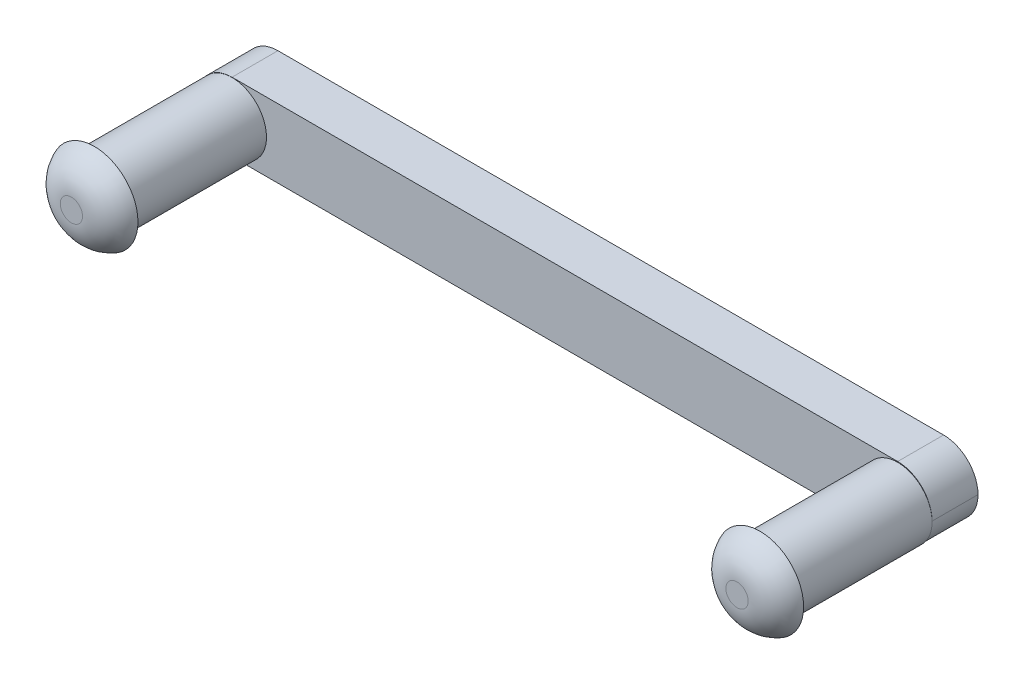
ISO-10303-21;
HEADER;
FILE_DESCRIPTION(('STEP AP214'),'2;1');
FILE_NAME('part.step','',(''),(''),'','','');
FILE_SCHEMA(('AUTOMOTIVE_DESIGN { 1 0 10303 214 1 1 1 1 }'));
ENDSEC;
DATA;
#1=APPLICATION_CONTEXT('core data for automotive mechanical design processes');
#2=APPLICATION_PROTOCOL_DEFINITION('international standard','automotive_design',2000,#1);
#3=PRODUCT_CONTEXT('',#1,'mechanical');
#4=PRODUCT('Part','Part','',(#3));
#5=PRODUCT_RELATED_PRODUCT_CATEGORY('part','',(#4));
#6=PRODUCT_DEFINITION_FORMATION('','',#4);
#7=PRODUCT_DEFINITION_CONTEXT('part definition',#1,'design');
#8=PRODUCT_DEFINITION('design','',#6,#7);
#9=PRODUCT_DEFINITION_SHAPE('','',#8);
#10=(LENGTH_UNIT() NAMED_UNIT(*) SI_UNIT(.MILLI.,.METRE.));
#11=(NAMED_UNIT(*) PLANE_ANGLE_UNIT() SI_UNIT($,.RADIAN.));
#12=(NAMED_UNIT(*) SI_UNIT($,.STERADIAN.) SOLID_ANGLE_UNIT());
#13=UNCERTAINTY_MEASURE_WITH_UNIT(LENGTH_MEASURE(1.E-05),#10,'distance_accuracy_value','');
#14=(GEOMETRIC_REPRESENTATION_CONTEXT(3) GLOBAL_UNCERTAINTY_ASSIGNED_CONTEXT((#13)) GLOBAL_UNIT_ASSIGNED_CONTEXT((#10,
#11,#12)) REPRESENTATION_CONTEXT('',''));
#15=CARTESIAN_POINT('',(0.,0.,0.));
#16=DIRECTION('',(0.,0.,1.));
#17=DIRECTION('',(1.,0.,0.));
#18=AXIS2_PLACEMENT_3D('',#15,#16,#17);
#19=CARTESIAN_POINT('',(17.5103207051958,11.8314666386004,2.));
#20=DIRECTION('',(0.,1.,0.));
#21=DIRECTION('',(0.,0.,1.));
#22=AXIS2_PLACEMENT_3D('',#19,#20,#21);
#23=PLANE('',#22);
#24=DIRECTION('',(1.,0.,0.));
#25=VECTOR('',#24,1.);
#26=CARTESIAN_POINT('',(17.5103207051958,11.8314666386004,2.));
#27=LINE('',#26,#25);
#28=CARTESIAN_POINT('',(19.0103207051958,11.8314666386004,2.));
#29=VERTEX_POINT('',#28);
#30=CARTESIAN_POINT('',(19.1841737499796,11.8314666386004,2.));
#31=VERTEX_POINT('',#30);
#32=EDGE_CURVE('E136',#29,#31,#27,.T.);
#33=ORIENTED_EDGE('',*,*,#32,.F.);
#34=DIRECTION('',(0.,0.,-1.));
#35=VECTOR('',#34,1.);
#36=CARTESIAN_POINT('',(19.0103207051958,11.8314666386004,2.));
#37=LINE('',#36,#35);
#38=CARTESIAN_POINT('',(19.0103207051958,11.8314666386004,0.));
#39=VERTEX_POINT('',#38);
#40=EDGE_CURVE('E205',#29,#39,#37,.T.);
#41=ORIENTED_EDGE('',*,*,#40,.T.);
#42=DIRECTION('',(1.,0.,0.));
#43=VECTOR('',#42,1.);
#44=CARTESIAN_POINT('',(17.5103207051958,11.8314666386004,0.));
#45=LINE('',#44,#43);
#46=CARTESIAN_POINT('',(48.0103207051958,11.8314666386004,0.));
#47=VERTEX_POINT('',#46);
#48=EDGE_CURVE('E145',#39,#47,#45,.T.);
#49=ORIENTED_EDGE('',*,*,#48,.T.);
#50=DIRECTION('',(0.,0.,-1.));
#51=VECTOR('',#50,1.);
#52=CARTESIAN_POINT('',(48.0103207051958,11.8314666386004,2.));
#53=LINE('',#52,#51);
#54=CARTESIAN_POINT('',(48.0103207051958,11.8314666386004,2.));
#55=VERTEX_POINT('',#54);
#56=EDGE_CURVE('E133',#47,#55,#53,.F.);
#57=ORIENTED_EDGE('',*,*,#56,.T.);
#58=CARTESIAN_POINT('',(47.7174160394953,11.8314666386004,2.));
#59=VERTEX_POINT('',#58);
#60=EDGE_CURVE('E109',#59,#55,#27,.T.);
#61=ORIENTED_EDGE('',*,*,#60,.F.);
#62=EDGE_CURVE('E131',#31,#59,#27,.T.);
#63=ORIENTED_EDGE('',*,*,#62,.F.);
#64=EDGE_LOOP('',(#33,#41,#49,#57,#61,#63));
#65=FACE_BOUND('',#64,.T.);
#66=ADVANCED_FACE('F33',(#65),#23,.F.);
#67=CARTESIAN_POINT('',(17.5103207051958,14.8314666386004,2.));
#68=DIRECTION('',(0.,-1.,0.));
#69=DIRECTION('',(0.,0.,-1.));
#70=AXIS2_PLACEMENT_3D('',#67,#68,#69);
#71=PLANE('',#70);
#72=DIRECTION('',(-1.,0.,0.));
#73=VECTOR('',#72,1.);
#74=CARTESIAN_POINT('',(17.5103207051958,14.8314666386004,0.));
#75=LINE('',#74,#73);
#76=CARTESIAN_POINT('',(48.0103207051958,14.8314666386004,0.));
#77=VERTEX_POINT('',#76);
#78=CARTESIAN_POINT('',(19.0103207051958,14.8314666386004,0.));
#79=VERTEX_POINT('',#78);
#80=EDGE_CURVE('E134',#77,#79,#75,.T.);
#81=ORIENTED_EDGE('',*,*,#80,.T.);
#82=DIRECTION('',(0.,0.,-1.));
#83=VECTOR('',#82,1.);
#84=CARTESIAN_POINT('',(19.0103207051958,14.8314666386004,2.));
#85=LINE('',#84,#83);
#86=CARTESIAN_POINT('',(19.0103207051958,14.8314666386004,2.));
#87=VERTEX_POINT('',#86);
#88=EDGE_CURVE('E270',#79,#87,#85,.F.);
#89=ORIENTED_EDGE('',*,*,#88,.T.);
#90=DIRECTION('',(-1.,0.,0.));
#91=VECTOR('',#90,1.);
#92=CARTESIAN_POINT('',(17.5103207051958,14.8314666386004,2.));
#93=LINE('',#92,#91);
#94=CARTESIAN_POINT('',(48.0103207051958,14.8314666386004,2.));
#95=VERTEX_POINT('',#94);
#96=EDGE_CURVE('E143',#95,#87,#93,.T.);
#97=ORIENTED_EDGE('',*,*,#96,.F.);
#98=DIRECTION('',(0.,0.,-1.));
#99=VECTOR('',#98,1.);
#100=CARTESIAN_POINT('',(48.0103207051958,14.8314666386004,2.));
#101=LINE('',#100,#99);
#102=EDGE_CURVE('E115',#95,#77,#101,.T.);
#103=ORIENTED_EDGE('',*,*,#102,.T.);
#104=EDGE_LOOP('',(#81,#89,#97,#103));
#105=FACE_BOUND('',#104,.T.);
#106=ADVANCED_FACE('F293',(#105),#71,.F.);
#107=CARTESIAN_POINT('',(0.,0.,2.));
#108=DIRECTION('',(0.,0.,1.));
#109=DIRECTION('',(1.,0.,0.));
#110=AXIS2_PLACEMENT_3D('',#107,#108,#109);
#111=PLANE('',#110);
#112=CARTESIAN_POINT('',(19.0103207051958,13.3314666386004,2.));
#113=DIRECTION('',(0.,0.,1.));
#114=DIRECTION('',(1.,0.,0.));
#115=AXIS2_PLACEMENT_3D('',#112,#113,#114);
#116=CIRCLE('',#115,1.5);
#117=CARTESIAN_POINT('',(17.5103207051958,13.3314666386004,2.));
#118=VERTEX_POINT('',#117);
#119=EDGE_CURVE('E55',#87,#118,#116,.T.);
#120=ORIENTED_EDGE('',*,*,#119,.T.);
#121=CARTESIAN_POINT('',(19.0103207051958,13.3314666386004,2.));
#122=DIRECTION('',(0.,0.,1.));
#123=DIRECTION('',(1.,0.,0.));
#124=AXIS2_PLACEMENT_3D('',#121,#122,#123);
#125=CIRCLE('',#124,1.5);
#126=CARTESIAN_POINT('',(17.519107837837,13.1693426606594,2.));
#127=VERTEX_POINT('',#126);
#128=EDGE_CURVE('E268',#118,#127,#125,.T.);
#129=ORIENTED_EDGE('',*,*,#128,.T.);
#130=CARTESIAN_POINT('',(19.0113726381342,13.321479986106,2.));
#131=DIRECTION('',(0.,0.,1.));
#132=DIRECTION('',(1.,0.,0.));
#133=AXIS2_PLACEMENT_3D('',#130,#131,#132);
#134=CIRCLE('',#133,1.5);
#135=EDGE_CURVE('E116',#31,#127,#134,.T.);
#136=ORIENTED_EDGE('',*,*,#135,.F.);
#137=ORIENTED_EDGE('',*,*,#62,.T.);
#138=CARTESIAN_POINT('',(48.0113726381342,13.3023811562106,2.));
#139=DIRECTION('',(0.,0.,1.));
#140=DIRECTION('',(1.,0.,0.));
#141=AXIS2_PLACEMENT_3D('',#138,#139,#140);
#142=CIRCLE('',#141,1.5);
#143=CARTESIAN_POINT('',(49.5097960524496,13.3711363118808,2.));
#144=VERTEX_POINT('',#143);
#145=EDGE_CURVE('E119',#144,#59,#142,.T.);
#146=ORIENTED_EDGE('',*,*,#145,.F.);
#147=CARTESIAN_POINT('',(48.0103207051958,13.3314666386004,2.));
#148=DIRECTION('',(0.,0.,1.));
#149=DIRECTION('',(1.,0.,0.));
#150=AXIS2_PLACEMENT_3D('',#147,#148,#149);
#151=CIRCLE('',#150,1.5);
#152=EDGE_CURVE('E193',#144,#95,#151,.T.);
#153=ORIENTED_EDGE('',*,*,#152,.T.);
#154=ORIENTED_EDGE('',*,*,#96,.T.);
#155=EDGE_LOOP('',(#120,#129,#136,#137,#146,#153,#154));
#156=FACE_BOUND('',#155,.T.);
#157=ADVANCED_FACE('F138',(#156),#111,.T.);
#158=CARTESIAN_POINT('',(0.,0.,0.));
#159=DIRECTION('',(0.,0.,1.));
#160=DIRECTION('',(1.,0.,0.));
#161=AXIS2_PLACEMENT_3D('',#158,#159,#160);
#162=PLANE('',#161);
#163=ORIENTED_EDGE('',*,*,#48,.F.);
#164=CARTESIAN_POINT('',(19.0103207051958,13.3314666386004,0.));
#165=DIRECTION('',(0.,0.,1.));
#166=DIRECTION('',(1.,0.,0.));
#167=AXIS2_PLACEMENT_3D('',#164,#165,#166);
#168=CIRCLE('',#167,1.5);
#169=CARTESIAN_POINT('',(17.5103207051958,13.3314666386004,0.));
#170=VERTEX_POINT('',#169);
#171=EDGE_CURVE('E265',#39,#170,#168,.F.);
#172=ORIENTED_EDGE('',*,*,#171,.T.);
#173=CARTESIAN_POINT('',(19.0103207051958,13.3314666386004,0.));
#174=DIRECTION('',(0.,0.,1.));
#175=DIRECTION('',(1.,0.,0.));
#176=AXIS2_PLACEMENT_3D('',#173,#174,#175);
#177=CIRCLE('',#176,1.5);
#178=EDGE_CURVE('E263',#170,#79,#177,.F.);
#179=ORIENTED_EDGE('',*,*,#178,.T.);
#180=ORIENTED_EDGE('',*,*,#80,.F.);
#181=CARTESIAN_POINT('',(48.0103207051958,13.3314666386004,0.));
#182=DIRECTION('',(0.,0.,1.));
#183=DIRECTION('',(1.,0.,0.));
#184=AXIS2_PLACEMENT_3D('',#181,#182,#183);
#185=CIRCLE('',#184,1.5);
#186=CARTESIAN_POINT('',(49.5103207051958,13.3314666386004,0.));
#187=VERTEX_POINT('',#186);
#188=EDGE_CURVE('E157',#77,#187,#185,.F.);
#189=ORIENTED_EDGE('',*,*,#188,.T.);
#190=CARTESIAN_POINT('',(48.0103207051958,13.3314666386004,0.));
#191=DIRECTION('',(0.,0.,1.));
#192=DIRECTION('',(1.,0.,0.));
#193=AXIS2_PLACEMENT_3D('',#190,#191,#192);
#194=CIRCLE('',#193,1.5);
#195=EDGE_CURVE('E154',#187,#47,#194,.F.);
#196=ORIENTED_EDGE('',*,*,#195,.T.);
#197=EDGE_LOOP('',(#163,#172,#179,#180,#189,#196));
#198=FACE_BOUND('',#197,.T.);
#199=ADVANCED_FACE('F301',(#198),#162,.F.);
#200=CARTESIAN_POINT('',(19.0113726381342,13.321479986106,2.));
#201=DIRECTION('',(0.,0.,1.));
#202=DIRECTION('',(1.,0.,0.));
#203=AXIS2_PLACEMENT_3D('',#200,#201,#202);
#204=PLANE('',#203);
#205=EDGE_CURVE('E48',#127,#31,#134,.T.);
#206=ORIENTED_EDGE('',*,*,#205,.F.);
#207=CARTESIAN_POINT('',(19.0103207051958,13.3314666386004,2.));
#208=DIRECTION('',(0.,0.,1.));
#209=DIRECTION('',(1.,0.,0.));
#210=AXIS2_PLACEMENT_3D('',#207,#208,#209);
#211=CIRCLE('',#210,1.5);
#212=EDGE_CURVE('E272',#127,#29,#211,.T.);
#213=ORIENTED_EDGE('',*,*,#212,.T.);
#214=ORIENTED_EDGE('',*,*,#32,.T.);
#215=EDGE_LOOP('',(#206,#213,#214));
#216=FACE_BOUND('',#215,.T.);
#217=ADVANCED_FACE('F185',(#216),#204,.F.);
#218=CARTESIAN_POINT('',(19.0113726381342,13.321479986106,8.));
#219=DIRECTION('',(0.,0.,-1.));
#220=DIRECTION('',(-1.,0.,0.));
#221=AXIS2_PLACEMENT_3D('',#218,#219,#220);
#222=CYLINDRICAL_SURFACE('',#221,1.5);
#223=CARTESIAN_POINT('',(19.0113726381342,13.321479986106,8.));
#224=DIRECTION('',(0.,0.,1.));
#225=DIRECTION('',(1.,0.,0.));
#226=AXIS2_PLACEMENT_3D('',#223,#224,#225);
#227=CIRCLE('',#226,1.5);
#228=CARTESIAN_POINT('',(20.5113726381342,13.321479986106,8.));
#229=VERTEX_POINT('',#228);
#230=EDGE_CURVE('E147',#229,#229,#227,.T.);
#231=ORIENTED_EDGE('',*,*,#230,.F.);
#232=EDGE_LOOP('',(#231));
#233=FACE_BOUND('',#232,.T.);
#234=ORIENTED_EDGE('',*,*,#205,.T.);
#235=ORIENTED_EDGE('',*,*,#135,.T.);
#236=EDGE_LOOP('',(#234,#235));
#237=FACE_BOUND('',#236,.T.);
#238=ADVANCED_FACE('F306',(#233,#237),#222,.T.);
#239=CARTESIAN_POINT('',(48.0113726381342,13.3023811562106,2.));
#240=DIRECTION('',(0.,0.,1.));
#241=DIRECTION('',(1.,0.,0.));
#242=AXIS2_PLACEMENT_3D('',#239,#240,#241);
#243=PLANE('',#242);
#244=CARTESIAN_POINT('',(48.0113726381342,13.3023811562106,2.));
#245=DIRECTION('',(0.,0.,1.));
#246=DIRECTION('',(1.,0.,0.));
#247=AXIS2_PLACEMENT_3D('',#244,#245,#246);
#248=CIRCLE('',#247,1.5);
#249=CARTESIAN_POINT('',(49.5103207051958,13.2462145090608,2.));
#250=VERTEX_POINT('',#249);
#251=EDGE_CURVE('E105',#250,#59,#248,.F.);
#252=ORIENTED_EDGE('',*,*,#251,.T.);
#253=ORIENTED_EDGE('',*,*,#60,.T.);
#254=CARTESIAN_POINT('',(48.0103207051958,13.3314666386004,2.));
#255=DIRECTION('',(0.,0.,1.));
#256=DIRECTION('',(1.,0.,0.));
#257=AXIS2_PLACEMENT_3D('',#254,#255,#256);
#258=CIRCLE('',#257,1.5);
#259=CARTESIAN_POINT('',(49.5107055193452,13.3314815724135,2.));
#260=VERTEX_POINT('',#259);
#261=EDGE_CURVE('E203',#55,#260,#258,.T.);
#262=ORIENTED_EDGE('',*,*,#261,.T.);
#263=CARTESIAN_POINT('',(48.0113726381342,13.3023811562106,2.));
#264=DIRECTION('',(0.,0.,1.));
#265=DIRECTION('',(0.999298711374452,-0.0374444314332525,0.));
#266=AXIS2_PLACEMENT_3D('',#263,#264,#265);
#267=CIRCLE('',#266,1.5);
#268=EDGE_CURVE('E112',#250,#260,#267,.T.);
#269=ORIENTED_EDGE('',*,*,#268,.F.);
#270=EDGE_LOOP('',(#252,#253,#262,#269));
#271=FACE_BOUND('',#270,.T.);
#272=ADVANCED_FACE('F107',(#271),#243,.F.);
#273=CARTESIAN_POINT('',(48.0113726381342,13.3023811562106,8.));
#274=DIRECTION('',(0.,0.,-1.));
#275=DIRECTION('',(-1.,0.,0.));
#276=AXIS2_PLACEMENT_3D('',#273,#274,#275);
#277=CYLINDRICAL_SURFACE('',#276,1.5);
#278=CARTESIAN_POINT('',(48.0113726381342,13.3023811562106,8.));
#279=DIRECTION('',(0.,0.,1.));
#280=DIRECTION('',(1.,0.,0.));
#281=AXIS2_PLACEMENT_3D('',#278,#279,#280);
#282=CIRCLE('',#281,1.5);
#283=CARTESIAN_POINT('',(49.5113726381342,13.3023811562106,8.));
#284=VERTEX_POINT('',#283);
#285=EDGE_CURVE('E165',#284,#284,#282,.T.);
#286=ORIENTED_EDGE('',*,*,#285,.F.);
#287=EDGE_LOOP('',(#286));
#288=FACE_BOUND('',#287,.T.);
#289=ORIENTED_EDGE('',*,*,#268,.T.);
#290=CARTESIAN_POINT('',(48.0113726381342,13.3023811562106,2.));
#291=DIRECTION('',(0.,0.,1.));
#292=DIRECTION('',(0.999811796906869,0.0194002774685683,0.));
#293=AXIS2_PLACEMENT_3D('',#290,#291,#292);
#294=CIRCLE('',#293,1.5);
#295=CARTESIAN_POINT('',(49.5103207051958,13.3585478033605,2.));
#296=VERTEX_POINT('',#295);
#297=EDGE_CURVE('E158',#260,#296,#294,.T.);
#298=ORIENTED_EDGE('',*,*,#297,.T.);
#299=CARTESIAN_POINT('',(48.0113726381342,13.3023811562106,2.));
#300=DIRECTION('',(0.,0.,1.));
#301=DIRECTION('',(0.999298711374452,0.0374444314332525,0.));
#302=AXIS2_PLACEMENT_3D('',#299,#300,#301);
#303=CIRCLE('',#302,1.5);
#304=EDGE_CURVE('E122',#296,#144,#303,.T.);
#305=ORIENTED_EDGE('',*,*,#304,.T.);
#306=ORIENTED_EDGE('',*,*,#145,.T.);
#307=ORIENTED_EDGE('',*,*,#251,.F.);
#308=EDGE_LOOP('',(#289,#298,#305,#306,#307));
#309=FACE_BOUND('',#308,.T.);
#310=ADVANCED_FACE('F120',(#288,#309),#277,.T.);
#311=CARTESIAN_POINT('',(19.0113726381342,13.321479986106,9.));
#312=DIRECTION('',(0.,0.,1.));
#313=DIRECTION('',(1.,0.,0.));
#314=AXIS2_PLACEMENT_3D('',#311,#312,#313);
#315=PLANE('',#314);
#316=CARTESIAN_POINT('',(19.0113726381342,13.321479986106,9.));
#317=DIRECTION('',(0.,0.,1.));
#318=DIRECTION('',(1.,0.,0.));
#319=AXIS2_PLACEMENT_3D('',#316,#317,#318);
#320=CIRCLE('',#319,0.485786437626913);
#321=CARTESIAN_POINT('',(19.4971590757611,13.321479986106,9.));
#322=VERTEX_POINT('',#321);
#323=EDGE_CURVE('E11',#322,#322,#320,.T.);
#324=ORIENTED_EDGE('',*,*,#323,.T.);
#325=EDGE_LOOP('',(#324));
#326=FACE_BOUND('',#325,.T.);
#327=ADVANCED_FACE('F181',(#326),#315,.T.);
#328=CARTESIAN_POINT('',(19.0113726381342,13.321479986106,8.));
#329=DIRECTION('',(0.,0.,1.));
#330=DIRECTION('',(1.,0.,0.));
#331=AXIS2_PLACEMENT_3D('',#328,#329,#330);
#332=PLANE('',#331);
#333=ORIENTED_EDGE('',*,*,#230,.T.);
#334=EDGE_LOOP('',(#333));
#335=FACE_BOUND('',#334,.T.);
#336=CARTESIAN_POINT('',(19.0113726381342,13.321479986106,8.));
#337=DIRECTION('',(0.,0.,1.));
#338=DIRECTION('',(1.,0.,0.));
#339=AXIS2_PLACEMENT_3D('',#336,#337,#338);
#340=CIRCLE('',#339,1.90000000000001);
#341=CARTESIAN_POINT('',(20.9113726381342,13.321479986106,8.));
#342=VERTEX_POINT('',#341);
#343=EDGE_CURVE('E126',#342,#342,#340,.T.);
#344=ORIENTED_EDGE('',*,*,#343,.F.);
#345=EDGE_LOOP('',(#344));
#346=FACE_BOUND('',#345,.T.);
#347=ADVANCED_FACE('F330',(#335,#346),#332,.F.);
#348=CARTESIAN_POINT('',(48.0113726381342,13.3023811562106,9.));
#349=DIRECTION('',(0.,0.,1.));
#350=DIRECTION('',(1.,0.,0.));
#351=AXIS2_PLACEMENT_3D('',#348,#349,#350);
#352=PLANE('',#351);
#353=CARTESIAN_POINT('',(48.0113726381342,13.3023811562106,9.));
#354=DIRECTION('',(0.,0.,1.));
#355=DIRECTION('',(1.,0.,0.));
#356=AXIS2_PLACEMENT_3D('',#353,#354,#355);
#357=CIRCLE('',#356,0.485786437626892);
#358=CARTESIAN_POINT('',(48.4971590757611,13.3023811562106,9.));
#359=VERTEX_POINT('',#358);
#360=EDGE_CURVE('E41',#359,#359,#357,.T.);
#361=ORIENTED_EDGE('',*,*,#360,.T.);
#362=EDGE_LOOP('',(#361));
#363=FACE_BOUND('',#362,.T.);
#364=ADVANCED_FACE('F278',(#363),#352,.T.);
#365=CARTESIAN_POINT('',(48.0113726381342,13.3023811562106,8.));
#366=DIRECTION('',(0.,0.,1.));
#367=DIRECTION('',(1.,0.,0.));
#368=AXIS2_PLACEMENT_3D('',#365,#366,#367);
#369=PLANE('',#368);
#370=ORIENTED_EDGE('',*,*,#285,.T.);
#371=EDGE_LOOP('',(#370));
#372=FACE_BOUND('',#371,.T.);
#373=CARTESIAN_POINT('',(48.0113726381342,13.3023811562106,8.));
#374=DIRECTION('',(0.,0.,1.));
#375=DIRECTION('',(1.,0.,0.));
#376=AXIS2_PLACEMENT_3D('',#373,#374,#375);
#377=CIRCLE('',#376,1.89999999999999);
#378=CARTESIAN_POINT('',(49.9113726381342,13.3023811562106,8.));
#379=VERTEX_POINT('',#378);
#380=EDGE_CURVE('E250',#379,#379,#377,.T.);
#381=ORIENTED_EDGE('',*,*,#380,.F.);
#382=EDGE_LOOP('',(#381));
#383=FACE_BOUND('',#382,.T.);
#384=ADVANCED_FACE('F320',(#372,#383),#369,.F.);
#385=CARTESIAN_POINT('',(48.0103207051958,13.3314666386004,2.));
#386=DIRECTION('',(0.,0.,-1.));
#387=DIRECTION('',(-1.,0.,0.));
#388=AXIS2_PLACEMENT_3D('',#385,#386,#387);
#389=CYLINDRICAL_SURFACE('',#388,1.5);
#390=DIRECTION('',(0.,0.,-1.));
#391=VECTOR('',#390,1.);
#392=CARTESIAN_POINT('',(49.5103207051958,13.3314666386004,2.));
#393=LINE('',#392,#391);
#394=EDGE_CURVE('E242',#260,#187,#393,.T.);
#395=ORIENTED_EDGE('',*,*,#394,.F.);
#396=ORIENTED_EDGE('',*,*,#261,.F.);
#397=ORIENTED_EDGE('',*,*,#56,.F.);
#398=ORIENTED_EDGE('',*,*,#195,.F.);
#399=EDGE_LOOP('',(#395,#396,#397,#398));
#400=FACE_BOUND('',#399,.T.);
#401=ADVANCED_FACE('F235',(#400),#389,.T.);
#402=CARTESIAN_POINT('',(48.0103207051958,13.3314666386004,2.));
#403=DIRECTION('',(0.,0.,-1.));
#404=DIRECTION('',(-1.,0.,0.));
#405=AXIS2_PLACEMENT_3D('',#402,#403,#404);
#406=CYLINDRICAL_SURFACE('',#405,1.5);
#407=ORIENTED_EDGE('',*,*,#297,.F.);
#408=ORIENTED_EDGE('',*,*,#394,.T.);
#409=ORIENTED_EDGE('',*,*,#188,.F.);
#410=ORIENTED_EDGE('',*,*,#102,.F.);
#411=ORIENTED_EDGE('',*,*,#152,.F.);
#412=ORIENTED_EDGE('',*,*,#304,.F.);
#413=EDGE_LOOP('',(#407,#408,#409,#410,#411,#412));
#414=FACE_BOUND('',#413,.T.);
#415=ADVANCED_FACE('F224',(#414),#406,.T.);
#416=CARTESIAN_POINT('',(19.0103207051958,13.3314666386004,2.));
#417=DIRECTION('',(0.,0.,-1.));
#418=DIRECTION('',(-1.,0.,0.));
#419=AXIS2_PLACEMENT_3D('',#416,#417,#418);
#420=CYLINDRICAL_SURFACE('',#419,1.5);
#421=DIRECTION('',(0.,0.,-1.));
#422=VECTOR('',#421,1.);
#423=CARTESIAN_POINT('',(17.5103207051958,13.3314666386004,2.));
#424=LINE('',#423,#422);
#425=EDGE_CURVE('E251',#118,#170,#424,.T.);
#426=ORIENTED_EDGE('',*,*,#425,.F.);
#427=ORIENTED_EDGE('',*,*,#119,.F.);
#428=ORIENTED_EDGE('',*,*,#88,.F.);
#429=ORIENTED_EDGE('',*,*,#178,.F.);
#430=EDGE_LOOP('',(#426,#427,#428,#429));
#431=FACE_BOUND('',#430,.T.);
#432=ADVANCED_FACE('F234',(#431),#420,.T.);
#433=CARTESIAN_POINT('',(19.0103207051958,13.3314666386004,2.));
#434=DIRECTION('',(0.,0.,-1.));
#435=DIRECTION('',(-1.,0.,0.));
#436=AXIS2_PLACEMENT_3D('',#433,#434,#435);
#437=CYLINDRICAL_SURFACE('',#436,1.5);
#438=ORIENTED_EDGE('',*,*,#128,.F.);
#439=ORIENTED_EDGE('',*,*,#425,.T.);
#440=ORIENTED_EDGE('',*,*,#171,.F.);
#441=ORIENTED_EDGE('',*,*,#40,.F.);
#442=ORIENTED_EDGE('',*,*,#212,.F.);
#443=EDGE_LOOP('',(#438,#439,#440,#441,#442));
#444=FACE_BOUND('',#443,.T.);
#445=ADVANCED_FACE('F282',(#444),#437,.T.);
#446=CARTESIAN_POINT('',(48.0113726381342,13.3023811562106,7.5));
#447=DIRECTION('',(0.,0.,-1.));
#448=DIRECTION('',(-1.,0.,0.));
#449=AXIS2_PLACEMENT_3D('',#446,#447,#448);
#450=DEGENERATE_TOROIDAL_SURFACE('',#449,0.485786437626892,1.5,.T.);
#451=ORIENTED_EDGE('',*,*,#380,.T.);
#452=EDGE_LOOP('',(#451));
#453=FACE_BOUND('',#452,.T.);
#454=ORIENTED_EDGE('',*,*,#360,.F.);
#455=EDGE_LOOP('',(#454));
#456=FACE_BOUND('',#455,.T.);
#457=ADVANCED_FACE('F280',(#453,#456),#450,.T.);
#458=CARTESIAN_POINT('',(19.0113726381342,13.321479986106,7.5));
#459=DIRECTION('',(0.,0.,-1.));
#460=DIRECTION('',(-1.,0.,0.));
#461=AXIS2_PLACEMENT_3D('',#458,#459,#460);
#462=DEGENERATE_TOROIDAL_SURFACE('',#461,0.485786437626913,1.5,.T.);
#463=ORIENTED_EDGE('',*,*,#343,.T.);
#464=EDGE_LOOP('',(#463));
#465=FACE_BOUND('',#464,.T.);
#466=ORIENTED_EDGE('',*,*,#323,.F.);
#467=EDGE_LOOP('',(#466));
#468=FACE_BOUND('',#467,.T.);
#469=ADVANCED_FACE('F35',(#465,#468),#462,.T.);
#470=CLOSED_SHELL('',(#66,#106,#157,#199,#217,#238,#272,#310,#327,#347,#364,#384,#401,#415,#432,
#445,#457,#469));
#471=MANIFOLD_SOLID_BREP('B2',#470);
#472=ADVANCED_BREP_SHAPE_REPRESENTATION('',(#18,#471),#14);
#473=SHAPE_DEFINITION_REPRESENTATION(#9,#472);
ENDSEC;
END-ISO-10303-21;
